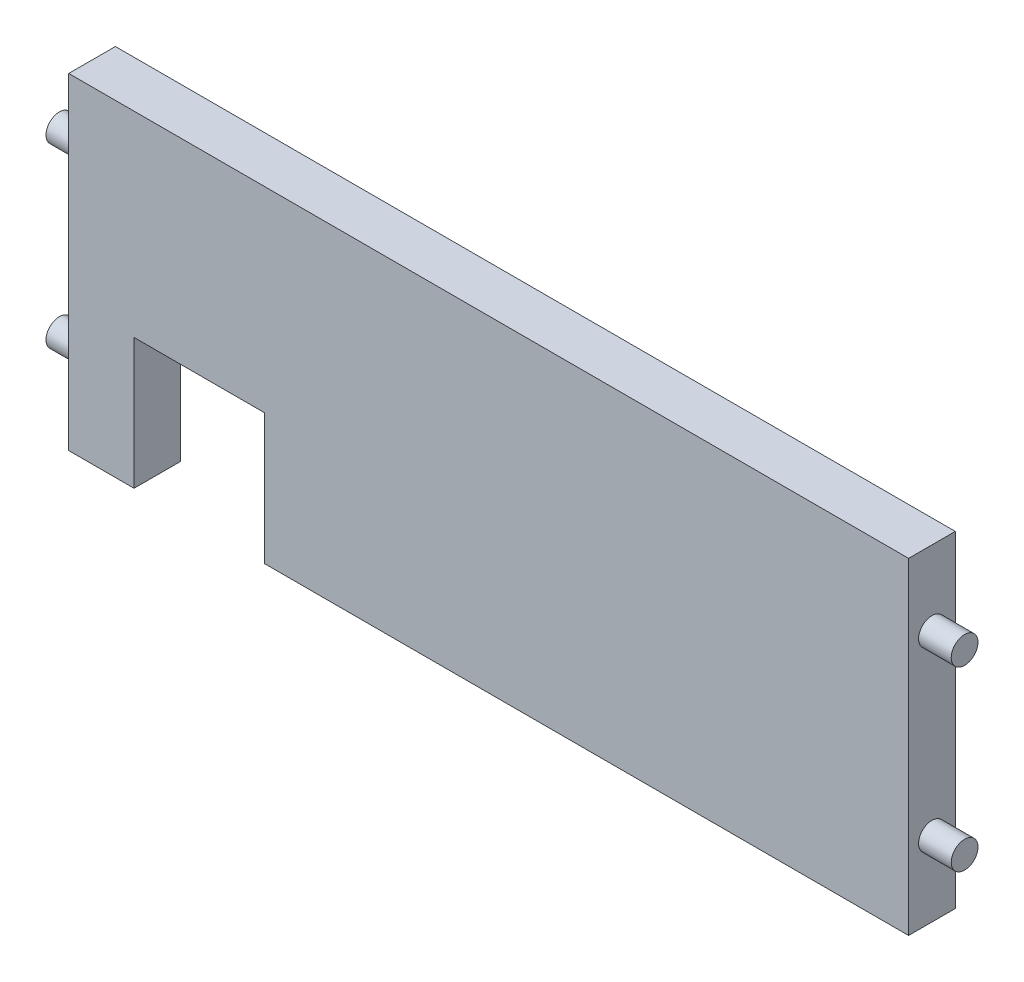
ISO-10303-21;
HEADER;
FILE_DESCRIPTION(('STEP AP214'),'2;1');
FILE_NAME('part.step','',(''),(''),'','','');
FILE_SCHEMA(('AUTOMOTIVE_DESIGN { 1 0 10303 214 1 1 1 1 }'));
ENDSEC;
DATA;
#1=APPLICATION_CONTEXT('core data for automotive mechanical design processes');
#2=APPLICATION_PROTOCOL_DEFINITION('international standard','automotive_design',2000,#1);
#3=PRODUCT_CONTEXT('',#1,'mechanical');
#4=PRODUCT('Part','Part','',(#3));
#5=PRODUCT_RELATED_PRODUCT_CATEGORY('part','',(#4));
#6=PRODUCT_DEFINITION_FORMATION('','',#4);
#7=PRODUCT_DEFINITION_CONTEXT('part definition',#1,'design');
#8=PRODUCT_DEFINITION('design','',#6,#7);
#9=PRODUCT_DEFINITION_SHAPE('','',#8);
#10=(LENGTH_UNIT() NAMED_UNIT(*) SI_UNIT(.MILLI.,.METRE.));
#11=(NAMED_UNIT(*) PLANE_ANGLE_UNIT() SI_UNIT($,.RADIAN.));
#12=(NAMED_UNIT(*) SI_UNIT($,.STERADIAN.) SOLID_ANGLE_UNIT());
#13=UNCERTAINTY_MEASURE_WITH_UNIT(LENGTH_MEASURE(1.E-05),#10,'distance_accuracy_value','');
#14=(GEOMETRIC_REPRESENTATION_CONTEXT(3) GLOBAL_UNCERTAINTY_ASSIGNED_CONTEXT((#13)) GLOBAL_UNIT_ASSIGNED_CONTEXT((#10,
#11,#12)) REPRESENTATION_CONTEXT('',''));
#15=CARTESIAN_POINT('',(0.,0.,0.));
#16=DIRECTION('',(0.,0.,1.));
#17=DIRECTION('',(1.,0.,0.));
#18=AXIS2_PLACEMENT_3D('',#15,#16,#17);
#19=CARTESIAN_POINT('',(-24.,0.,5.));
#20=DIRECTION('',(-1.,0.,0.));
#21=DIRECTION('',(0.,-1.,0.));
#22=AXIS2_PLACEMENT_3D('',#19,#20,#21);
#23=PLANE('',#22);
#24=DIRECTION('',(0.,1.,0.));
#25=VECTOR('',#24,1.);
#26=CARTESIAN_POINT('',(-24.,0.,0.));
#27=LINE('',#26,#25);
#28=CARTESIAN_POINT('',(-24.,-17.5,0.));
#29=VERTEX_POINT('',#28);
#30=CARTESIAN_POINT('',(-24.,-3.5,0.));
#31=VERTEX_POINT('',#30);
#32=EDGE_CURVE('E146',#29,#31,#27,.T.);
#33=ORIENTED_EDGE('',*,*,#32,.F.);
#34=DIRECTION('',(0.,0.,-1.));
#35=VECTOR('',#34,1.);
#36=CARTESIAN_POINT('',(-24.,-17.5,5.));
#37=LINE('',#36,#35);
#38=CARTESIAN_POINT('',(-24.,-17.5,5.));
#39=VERTEX_POINT('',#38);
#40=EDGE_CURVE('E102',#39,#29,#37,.T.);
#41=ORIENTED_EDGE('',*,*,#40,.F.);
#42=DIRECTION('',(0.,1.,0.));
#43=VECTOR('',#42,1.);
#44=CARTESIAN_POINT('',(-24.,0.,5.));
#45=LINE('',#44,#43);
#46=CARTESIAN_POINT('',(-24.,-3.5,5.));
#47=VERTEX_POINT('',#46);
#48=EDGE_CURVE('E171',#39,#47,#45,.T.);
#49=ORIENTED_EDGE('',*,*,#48,.T.);
#50=DIRECTION('',(0.,0.,-1.));
#51=VECTOR('',#50,1.);
#52=CARTESIAN_POINT('',(-24.,-3.5,5.));
#53=LINE('',#52,#51);
#54=EDGE_CURVE('E97',#47,#31,#53,.T.);
#55=ORIENTED_EDGE('',*,*,#54,.T.);
#56=EDGE_LOOP('',(#33,#41,#49,#55));
#57=FACE_BOUND('',#56,.T.);
#58=ADVANCED_FACE('F44',(#57),#23,.T.);
#59=CARTESIAN_POINT('',(0.,-17.5,5.));
#60=DIRECTION('',(0.,1.,0.));
#61=DIRECTION('',(0.,0.,1.));
#62=AXIS2_PLACEMENT_3D('',#59,#60,#61);
#63=PLANE('',#62);
#64=DIRECTION('',(1.,0.,0.));
#65=VECTOR('',#64,1.);
#66=CARTESIAN_POINT('',(0.,-17.5,0.));
#67=LINE('',#66,#65);
#68=CARTESIAN_POINT('',(45.,-17.5,0.));
#69=VERTEX_POINT('',#68);
#70=EDGE_CURVE('E150',#29,#69,#67,.T.);
#71=ORIENTED_EDGE('',*,*,#70,.T.);
#72=DIRECTION('',(0.,0.,-1.));
#73=VECTOR('',#72,1.);
#74=CARTESIAN_POINT('',(45.,-17.5,5.));
#75=LINE('',#74,#73);
#76=CARTESIAN_POINT('',(45.,-17.5,5.));
#77=VERTEX_POINT('',#76);
#78=EDGE_CURVE('E184',#77,#69,#75,.T.);
#79=ORIENTED_EDGE('',*,*,#78,.F.);
#80=DIRECTION('',(1.,0.,0.));
#81=VECTOR('',#80,1.);
#82=CARTESIAN_POINT('',(0.,-17.5,5.));
#83=LINE('',#82,#81);
#84=EDGE_CURVE('E129',#39,#77,#83,.T.);
#85=ORIENTED_EDGE('',*,*,#84,.F.);
#86=ORIENTED_EDGE('',*,*,#40,.T.);
#87=EDGE_LOOP('',(#71,#79,#85,#86));
#88=FACE_BOUND('',#87,.T.);
#89=ADVANCED_FACE('F199',(#88),#63,.F.);
#90=CARTESIAN_POINT('',(45.,0.,5.));
#91=DIRECTION('',(-1.,0.,0.));
#92=DIRECTION('',(0.,0.,1.));
#93=AXIS2_PLACEMENT_3D('',#90,#91,#92);
#94=PLANE('',#93);
#95=CARTESIAN_POINT('',(45.,-9.5,2.5));
#96=DIRECTION('',(-1.,0.,0.));
#97=DIRECTION('',(0.,0.,1.));
#98=AXIS2_PLACEMENT_3D('',#95,#96,#97);
#99=CIRCLE('',#98,1.435);
#100=CARTESIAN_POINT('',(45.,-9.5,3.935));
#101=VERTEX_POINT('',#100);
#102=EDGE_CURVE('E11',#101,#101,#99,.F.);
#103=ORIENTED_EDGE('',*,*,#102,.F.);
#104=EDGE_LOOP('',(#103));
#105=FACE_BOUND('',#104,.T.);
#106=CARTESIAN_POINT('',(45.,9.5,2.5));
#107=DIRECTION('',(-1.,0.,0.));
#108=DIRECTION('',(0.,0.,1.));
#109=AXIS2_PLACEMENT_3D('',#106,#107,#108);
#110=CIRCLE('',#109,1.435);
#111=CARTESIAN_POINT('',(45.,9.5,3.935));
#112=VERTEX_POINT('',#111);
#113=EDGE_CURVE('E53',#112,#112,#110,.F.);
#114=ORIENTED_EDGE('',*,*,#113,.F.);
#115=EDGE_LOOP('',(#114));
#116=FACE_BOUND('',#115,.T.);
#117=DIRECTION('',(0.,1.,0.));
#118=VECTOR('',#117,1.);
#119=CARTESIAN_POINT('',(45.,0.,0.));
#120=LINE('',#119,#118);
#121=CARTESIAN_POINT('',(45.,17.5,0.));
#122=VERTEX_POINT('',#121);
#123=EDGE_CURVE('E154',#69,#122,#120,.T.);
#124=ORIENTED_EDGE('',*,*,#123,.T.);
#125=DIRECTION('',(0.,0.,-1.));
#126=VECTOR('',#125,1.);
#127=CARTESIAN_POINT('',(45.,17.5,5.));
#128=LINE('',#127,#126);
#129=CARTESIAN_POINT('',(45.,17.5,5.));
#130=VERTEX_POINT('',#129);
#131=EDGE_CURVE('E181',#130,#122,#128,.T.);
#132=ORIENTED_EDGE('',*,*,#131,.F.);
#133=DIRECTION('',(0.,1.,0.));
#134=VECTOR('',#133,1.);
#135=CARTESIAN_POINT('',(45.,0.,5.));
#136=LINE('',#135,#134);
#137=EDGE_CURVE('E214',#77,#130,#136,.T.);
#138=ORIENTED_EDGE('',*,*,#137,.F.);
#139=ORIENTED_EDGE('',*,*,#78,.T.);
#140=EDGE_LOOP('',(#124,#132,#138,#139));
#141=FACE_BOUND('',#140,.T.);
#142=ADVANCED_FACE('F195',(#105,#116,#141),#94,.F.);
#143=CARTESIAN_POINT('',(0.,17.5,5.));
#144=DIRECTION('',(0.,1.,0.));
#145=DIRECTION('',(0.,0.,1.));
#146=AXIS2_PLACEMENT_3D('',#143,#144,#145);
#147=PLANE('',#146);
#148=DIRECTION('',(1.,0.,0.));
#149=VECTOR('',#148,1.);
#150=CARTESIAN_POINT('',(0.,17.5,0.));
#151=LINE('',#150,#149);
#152=CARTESIAN_POINT('',(-45.,17.5,0.));
#153=VERTEX_POINT('',#152);
#154=EDGE_CURVE('E158',#153,#122,#151,.T.);
#155=ORIENTED_EDGE('',*,*,#154,.F.);
#156=DIRECTION('',(0.,0.,-1.));
#157=VECTOR('',#156,1.);
#158=CARTESIAN_POINT('',(-45.,17.5,5.));
#159=LINE('',#158,#157);
#160=CARTESIAN_POINT('',(-45.,17.5,5.));
#161=VERTEX_POINT('',#160);
#162=EDGE_CURVE('E178',#161,#153,#159,.T.);
#163=ORIENTED_EDGE('',*,*,#162,.F.);
#164=DIRECTION('',(1.,0.,0.));
#165=VECTOR('',#164,1.);
#166=CARTESIAN_POINT('',(0.,17.5,5.));
#167=LINE('',#166,#165);
#168=EDGE_CURVE('E212',#161,#130,#167,.T.);
#169=ORIENTED_EDGE('',*,*,#168,.T.);
#170=ORIENTED_EDGE('',*,*,#131,.T.);
#171=EDGE_LOOP('',(#155,#163,#169,#170));
#172=FACE_BOUND('',#171,.T.);
#173=ADVANCED_FACE('F198',(#172),#147,.T.);
#174=CARTESIAN_POINT('',(-45.,0.,5.));
#175=DIRECTION('',(-1.,0.,0.));
#176=DIRECTION('',(0.,0.,1.));
#177=AXIS2_PLACEMENT_3D('',#174,#175,#176);
#178=PLANE('',#177);
#179=CARTESIAN_POINT('',(-45.,-9.5,2.5));
#180=DIRECTION('',(-1.,0.,0.));
#181=DIRECTION('',(0.,0.,-1.));
#182=AXIS2_PLACEMENT_3D('',#179,#180,#181);
#183=CIRCLE('',#182,1.435);
#184=CARTESIAN_POINT('',(-45.,-9.5,1.065));
#185=VERTEX_POINT('',#184);
#186=EDGE_CURVE('E234',#185,#185,#183,.T.);
#187=ORIENTED_EDGE('',*,*,#186,.F.);
#188=EDGE_LOOP('',(#187));
#189=FACE_BOUND('',#188,.T.);
#190=CARTESIAN_POINT('',(-45.,9.5,2.5));
#191=DIRECTION('',(-1.,0.,0.));
#192=DIRECTION('',(0.,0.,1.));
#193=AXIS2_PLACEMENT_3D('',#190,#191,#192);
#194=CIRCLE('',#193,1.435);
#195=CARTESIAN_POINT('',(-45.,9.5,3.935));
#196=VERTEX_POINT('',#195);
#197=EDGE_CURVE('E230',#196,#196,#194,.T.);
#198=ORIENTED_EDGE('',*,*,#197,.F.);
#199=EDGE_LOOP('',(#198));
#200=FACE_BOUND('',#199,.T.);
#201=DIRECTION('',(0.,1.,0.));
#202=VECTOR('',#201,1.);
#203=CARTESIAN_POINT('',(-45.,0.,0.));
#204=LINE('',#203,#202);
#205=CARTESIAN_POINT('',(-45.,-17.5,0.));
#206=VERTEX_POINT('',#205);
#207=EDGE_CURVE('E162',#206,#153,#204,.T.);
#208=ORIENTED_EDGE('',*,*,#207,.F.);
#209=DIRECTION('',(0.,0.,-1.));
#210=VECTOR('',#209,1.);
#211=CARTESIAN_POINT('',(-45.,-17.5,5.));
#212=LINE('',#211,#210);
#213=CARTESIAN_POINT('',(-45.,-17.5,5.));
#214=VERTEX_POINT('',#213);
#215=EDGE_CURVE('E135',#214,#206,#212,.T.);
#216=ORIENTED_EDGE('',*,*,#215,.F.);
#217=DIRECTION('',(0.,1.,0.));
#218=VECTOR('',#217,1.);
#219=CARTESIAN_POINT('',(-45.,0.,5.));
#220=LINE('',#219,#218);
#221=EDGE_CURVE('E125',#214,#161,#220,.T.);
#222=ORIENTED_EDGE('',*,*,#221,.T.);
#223=ORIENTED_EDGE('',*,*,#162,.T.);
#224=EDGE_LOOP('',(#208,#216,#222,#223));
#225=FACE_BOUND('',#224,.T.);
#226=ADVANCED_FACE('F248',(#189,#200,#225),#178,.T.);
#227=CARTESIAN_POINT('',(-38.,-17.5,0.));
#228=VERTEX_POINT('',#227);
#229=EDGE_CURVE('E133',#206,#228,#67,.T.);
#230=ORIENTED_EDGE('',*,*,#229,.T.);
#231=DIRECTION('',(0.,0.,-1.));
#232=VECTOR('',#231,1.);
#233=CARTESIAN_POINT('',(-38.,-17.5,5.));
#234=LINE('',#233,#232);
#235=CARTESIAN_POINT('',(-38.,-17.5,5.));
#236=VERTEX_POINT('',#235);
#237=EDGE_CURVE('E130',#236,#228,#234,.T.);
#238=ORIENTED_EDGE('',*,*,#237,.F.);
#239=EDGE_CURVE('E118',#214,#236,#83,.T.);
#240=ORIENTED_EDGE('',*,*,#239,.F.);
#241=ORIENTED_EDGE('',*,*,#215,.T.);
#242=EDGE_LOOP('',(#230,#238,#240,#241));
#243=FACE_BOUND('',#242,.T.);
#244=ADVANCED_FACE('F131',(#243),#63,.F.);
#245=CARTESIAN_POINT('',(-38.,0.,5.));
#246=DIRECTION('',(-1.,0.,0.));
#247=DIRECTION('',(0.,-1.,0.));
#248=AXIS2_PLACEMENT_3D('',#245,#246,#247);
#249=PLANE('',#248);
#250=DIRECTION('',(0.,1.,0.));
#251=VECTOR('',#250,1.);
#252=CARTESIAN_POINT('',(-38.,0.,0.));
#253=LINE('',#252,#251);
#254=CARTESIAN_POINT('',(-38.,-3.5,0.));
#255=VERTEX_POINT('',#254);
#256=EDGE_CURVE('E90',#228,#255,#253,.T.);
#257=ORIENTED_EDGE('',*,*,#256,.T.);
#258=DIRECTION('',(0.,0.,-1.));
#259=VECTOR('',#258,1.);
#260=CARTESIAN_POINT('',(-38.,-3.5,5.));
#261=LINE('',#260,#259);
#262=CARTESIAN_POINT('',(-38.,-3.5,5.));
#263=VERTEX_POINT('',#262);
#264=EDGE_CURVE('E136',#263,#255,#261,.T.);
#265=ORIENTED_EDGE('',*,*,#264,.F.);
#266=DIRECTION('',(0.,1.,0.));
#267=VECTOR('',#266,1.);
#268=CARTESIAN_POINT('',(-38.,0.,5.));
#269=LINE('',#268,#267);
#270=EDGE_CURVE('E122',#236,#263,#269,.T.);
#271=ORIENTED_EDGE('',*,*,#270,.F.);
#272=ORIENTED_EDGE('',*,*,#237,.T.);
#273=EDGE_LOOP('',(#257,#265,#271,#272));
#274=FACE_BOUND('',#273,.T.);
#275=ADVANCED_FACE('F138',(#274),#249,.F.);
#276=CARTESIAN_POINT('',(0.,-3.5,5.));
#277=DIRECTION('',(0.,1.,0.));
#278=DIRECTION('',(0.,0.,1.));
#279=AXIS2_PLACEMENT_3D('',#276,#277,#278);
#280=PLANE('',#279);
#281=DIRECTION('',(1.,0.,0.));
#282=VECTOR('',#281,1.);
#283=CARTESIAN_POINT('',(0.,-3.5,0.));
#284=LINE('',#283,#282);
#285=EDGE_CURVE('E168',#255,#31,#284,.T.);
#286=ORIENTED_EDGE('',*,*,#285,.T.);
#287=ORIENTED_EDGE('',*,*,#54,.F.);
#288=DIRECTION('',(1.,0.,0.));
#289=VECTOR('',#288,1.);
#290=CARTESIAN_POINT('',(0.,-3.5,5.));
#291=LINE('',#290,#289);
#292=EDGE_CURVE('E61',#263,#47,#291,.T.);
#293=ORIENTED_EDGE('',*,*,#292,.F.);
#294=ORIENTED_EDGE('',*,*,#264,.T.);
#295=EDGE_LOOP('',(#286,#287,#293,#294));
#296=FACE_BOUND('',#295,.T.);
#297=ADVANCED_FACE('F257',(#296),#280,.F.);
#298=CARTESIAN_POINT('',(0.,0.,5.));
#299=DIRECTION('',(0.,0.,1.));
#300=DIRECTION('',(1.,0.,0.));
#301=AXIS2_PLACEMENT_3D('',#298,#299,#300);
#302=PLANE('',#301);
#303=ORIENTED_EDGE('',*,*,#48,.F.);
#304=ORIENTED_EDGE('',*,*,#84,.T.);
#305=ORIENTED_EDGE('',*,*,#137,.T.);
#306=ORIENTED_EDGE('',*,*,#168,.F.);
#307=ORIENTED_EDGE('',*,*,#221,.F.);
#308=ORIENTED_EDGE('',*,*,#239,.T.);
#309=ORIENTED_EDGE('',*,*,#270,.T.);
#310=ORIENTED_EDGE('',*,*,#292,.T.);
#311=EDGE_LOOP('',(#303,#304,#305,#306,#307,#308,#309,#310));
#312=FACE_BOUND('',#311,.T.);
#313=ADVANCED_FACE('F120',(#312),#302,.T.);
#314=CARTESIAN_POINT('',(0.,0.,0.));
#315=DIRECTION('',(0.,0.,1.));
#316=DIRECTION('',(1.,0.,0.));
#317=AXIS2_PLACEMENT_3D('',#314,#315,#316);
#318=PLANE('',#317);
#319=ORIENTED_EDGE('',*,*,#32,.T.);
#320=ORIENTED_EDGE('',*,*,#285,.F.);
#321=ORIENTED_EDGE('',*,*,#256,.F.);
#322=ORIENTED_EDGE('',*,*,#229,.F.);
#323=ORIENTED_EDGE('',*,*,#207,.T.);
#324=ORIENTED_EDGE('',*,*,#154,.T.);
#325=ORIENTED_EDGE('',*,*,#123,.F.);
#326=ORIENTED_EDGE('',*,*,#70,.F.);
#327=EDGE_LOOP('',(#319,#320,#321,#322,#323,#324,#325,#326));
#328=FACE_BOUND('',#327,.T.);
#329=ADVANCED_FACE('F209',(#328),#318,.F.);
#330=CARTESIAN_POINT('',(48.5,9.5,2.5));
#331=DIRECTION('',(-1.,0.,0.));
#332=DIRECTION('',(0.,0.,1.));
#333=AXIS2_PLACEMENT_3D('',#330,#331,#332);
#334=CYLINDRICAL_SURFACE('',#333,1.435);
#335=CARTESIAN_POINT('',(48.5,9.5,2.5));
#336=DIRECTION('',(1.,0.,0.));
#337=DIRECTION('',(0.,0.,-1.));
#338=AXIS2_PLACEMENT_3D('',#335,#336,#337);
#339=CIRCLE('',#338,1.435);
#340=CARTESIAN_POINT('',(48.5,9.5,1.065));
#341=VERTEX_POINT('',#340);
#342=EDGE_CURVE('E151',#341,#341,#339,.T.);
#343=ORIENTED_EDGE('',*,*,#342,.F.);
#344=EDGE_LOOP('',(#343));
#345=FACE_BOUND('',#344,.T.);
#346=ORIENTED_EDGE('',*,*,#113,.T.);
#347=EDGE_LOOP('',(#346));
#348=FACE_BOUND('',#347,.T.);
#349=ADVANCED_FACE('F193',(#345,#348),#334,.T.);
#350=CARTESIAN_POINT('',(48.5,9.5,2.5));
#351=DIRECTION('',(1.,0.,0.));
#352=DIRECTION('',(0.,0.,-1.));
#353=AXIS2_PLACEMENT_3D('',#350,#351,#352);
#354=PLANE('',#353);
#355=ORIENTED_EDGE('',*,*,#342,.T.);
#356=EDGE_LOOP('',(#355));
#357=FACE_BOUND('',#356,.T.);
#358=ADVANCED_FACE('F280',(#357),#354,.T.);
#359=CARTESIAN_POINT('',(48.5,-9.5,2.5));
#360=DIRECTION('',(-1.,0.,0.));
#361=DIRECTION('',(0.,0.,1.));
#362=AXIS2_PLACEMENT_3D('',#359,#360,#361);
#363=CYLINDRICAL_SURFACE('',#362,1.435);
#364=CARTESIAN_POINT('',(48.5,-9.5,2.5));
#365=DIRECTION('',(1.,0.,0.));
#366=DIRECTION('',(0.,0.,1.));
#367=AXIS2_PLACEMENT_3D('',#364,#365,#366);
#368=CIRCLE('',#367,1.435);
#369=CARTESIAN_POINT('',(48.5,-9.5,3.935));
#370=VERTEX_POINT('',#369);
#371=EDGE_CURVE('E225',#370,#370,#368,.T.);
#372=ORIENTED_EDGE('',*,*,#371,.F.);
#373=EDGE_LOOP('',(#372));
#374=FACE_BOUND('',#373,.T.);
#375=ORIENTED_EDGE('',*,*,#102,.T.);
#376=EDGE_LOOP('',(#375));
#377=FACE_BOUND('',#376,.T.);
#378=ADVANCED_FACE('F284',(#374,#377),#363,.T.);
#379=CARTESIAN_POINT('',(48.5,-9.5,2.5));
#380=DIRECTION('',(-1.,0.,0.));
#381=DIRECTION('',(0.,0.,1.));
#382=AXIS2_PLACEMENT_3D('',#379,#380,#381);
#383=PLANE('',#382);
#384=ORIENTED_EDGE('',*,*,#371,.T.);
#385=EDGE_LOOP('',(#384));
#386=FACE_BOUND('',#385,.T.);
#387=ADVANCED_FACE('F286',(#386),#383,.F.);
#388=CARTESIAN_POINT('',(-48.5,9.5,2.5));
#389=DIRECTION('',(1.,0.,0.));
#390=DIRECTION('',(0.,0.,-1.));
#391=AXIS2_PLACEMENT_3D('',#388,#389,#390);
#392=CYLINDRICAL_SURFACE('',#391,1.435);
#393=CARTESIAN_POINT('',(-48.5,9.5,2.5));
#394=DIRECTION('',(-1.,0.,0.));
#395=DIRECTION('',(0.,0.,1.));
#396=AXIS2_PLACEMENT_3D('',#393,#394,#395);
#397=CIRCLE('',#396,1.435);
#398=CARTESIAN_POINT('',(-48.5,9.5,3.935));
#399=VERTEX_POINT('',#398);
#400=EDGE_CURVE('E229',#399,#399,#397,.T.);
#401=ORIENTED_EDGE('',*,*,#400,.F.);
#402=EDGE_LOOP('',(#401));
#403=FACE_BOUND('',#402,.T.);
#404=ORIENTED_EDGE('',*,*,#197,.T.);
#405=EDGE_LOOP('',(#404));
#406=FACE_BOUND('',#405,.T.);
#407=ADVANCED_FACE('F289',(#403,#406),#392,.T.);
#408=CARTESIAN_POINT('',(-48.5,9.5,2.5));
#409=DIRECTION('',(-1.,0.,0.));
#410=DIRECTION('',(0.,0.,1.));
#411=AXIS2_PLACEMENT_3D('',#408,#409,#410);
#412=PLANE('',#411);
#413=ORIENTED_EDGE('',*,*,#400,.T.);
#414=EDGE_LOOP('',(#413));
#415=FACE_BOUND('',#414,.T.);
#416=ADVANCED_FACE('F296',(#415),#412,.T.);
#417=CARTESIAN_POINT('',(-48.5,-9.5,2.5));
#418=DIRECTION('',(1.,0.,0.));
#419=DIRECTION('',(0.,0.,-1.));
#420=AXIS2_PLACEMENT_3D('',#417,#418,#419);
#421=CYLINDRICAL_SURFACE('',#420,1.435);
#422=CARTESIAN_POINT('',(-48.5,-9.5,2.5));
#423=DIRECTION('',(-1.,0.,0.));
#424=DIRECTION('',(0.,0.,-1.));
#425=AXIS2_PLACEMENT_3D('',#422,#423,#424);
#426=CIRCLE('',#425,1.435);
#427=CARTESIAN_POINT('',(-48.5,-9.5,1.065));
#428=VERTEX_POINT('',#427);
#429=EDGE_CURVE('E238',#428,#428,#426,.T.);
#430=ORIENTED_EDGE('',*,*,#429,.F.);
#431=EDGE_LOOP('',(#430));
#432=FACE_BOUND('',#431,.T.);
#433=ORIENTED_EDGE('',*,*,#186,.T.);
#434=EDGE_LOOP('',(#433));
#435=FACE_BOUND('',#434,.T.);
#436=ADVANCED_FACE('F246',(#432,#435),#421,.T.);
#437=CARTESIAN_POINT('',(-48.5,-9.5,2.5));
#438=DIRECTION('',(1.,0.,0.));
#439=DIRECTION('',(0.,0.,-1.));
#440=AXIS2_PLACEMENT_3D('',#437,#438,#439);
#441=PLANE('',#440);
#442=ORIENTED_EDGE('',*,*,#429,.T.);
#443=EDGE_LOOP('',(#442));
#444=FACE_BOUND('',#443,.T.);
#445=ADVANCED_FACE('F301',(#444),#441,.F.);
#446=CLOSED_SHELL('',(#58,#89,#142,#173,#226,#244,#275,#297,#313,#329,#349,#358,#378,#387,#407,
#416,#436,#445));
#447=MANIFOLD_SOLID_BREP('B2',#446);
#448=ADVANCED_BREP_SHAPE_REPRESENTATION('',(#18,#447),#14);
#449=SHAPE_DEFINITION_REPRESENTATION(#9,#448);
ENDSEC;
END-ISO-10303-21;
